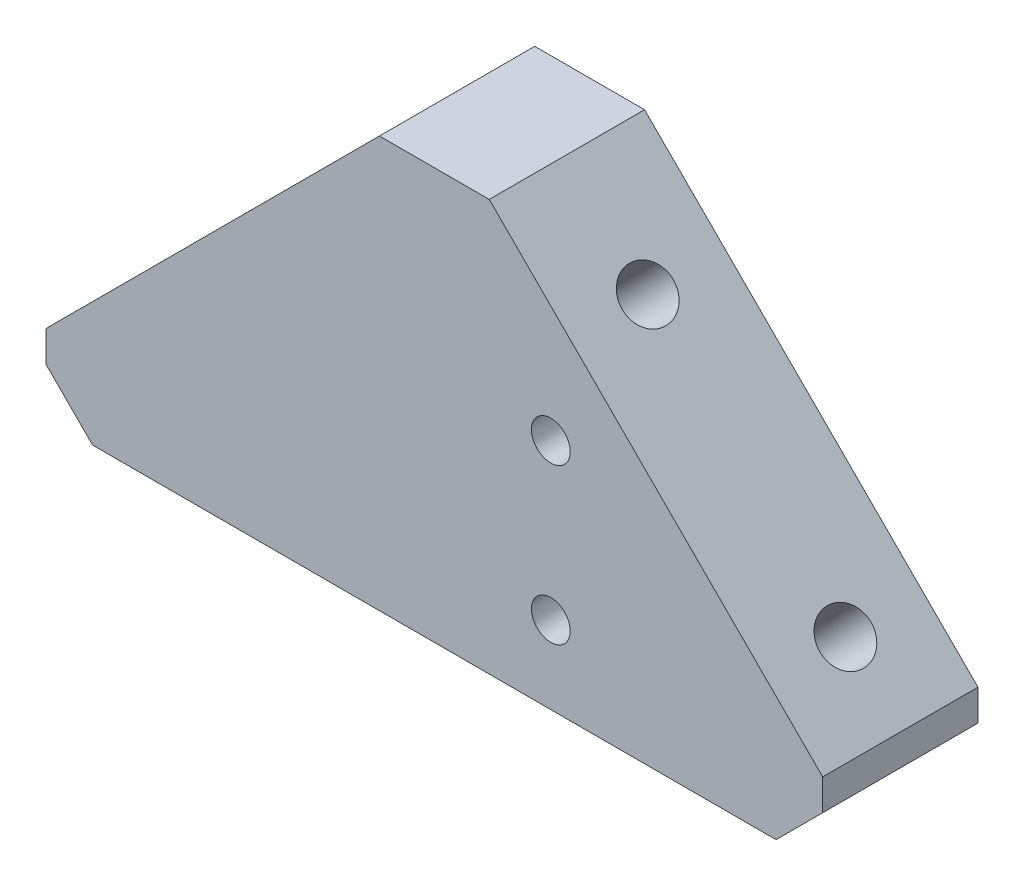
ISO-10303-21;
HEADER;
FILE_DESCRIPTION(('STEP AP214'),'2;1');
FILE_NAME('part.step','',(''),(''),'','','');
FILE_SCHEMA(('AUTOMOTIVE_DESIGN { 1 0 10303 214 1 1 1 1 }'));
ENDSEC;
DATA;
#1=APPLICATION_CONTEXT('core data for automotive mechanical design processes');
#2=APPLICATION_PROTOCOL_DEFINITION('international standard','automotive_design',2000,#1);
#3=PRODUCT_CONTEXT('',#1,'mechanical');
#4=PRODUCT('Part','Part','',(#3));
#5=PRODUCT_RELATED_PRODUCT_CATEGORY('part','',(#4));
#6=PRODUCT_DEFINITION_FORMATION('','',#4);
#7=PRODUCT_DEFINITION_CONTEXT('part definition',#1,'design');
#8=PRODUCT_DEFINITION('design','',#6,#7);
#9=PRODUCT_DEFINITION_SHAPE('','',#8);
#10=(LENGTH_UNIT() NAMED_UNIT(*) SI_UNIT(.MILLI.,.METRE.));
#11=(NAMED_UNIT(*) PLANE_ANGLE_UNIT() SI_UNIT($,.RADIAN.));
#12=(NAMED_UNIT(*) SI_UNIT($,.STERADIAN.) SOLID_ANGLE_UNIT());
#13=UNCERTAINTY_MEASURE_WITH_UNIT(LENGTH_MEASURE(1.E-05),#10,'distance_accuracy_value','');
#14=(GEOMETRIC_REPRESENTATION_CONTEXT(3) GLOBAL_UNCERTAINTY_ASSIGNED_CONTEXT((#13)) GLOBAL_UNIT_ASSIGNED_CONTEXT((#10,
#11,#12)) REPRESENTATION_CONTEXT('',''));
#15=CARTESIAN_POINT('',(0.,0.,0.));
#16=DIRECTION('',(0.,0.,1.));
#17=DIRECTION('',(1.,0.,0.));
#18=AXIS2_PLACEMENT_3D('',#15,#16,#17);
#19=CARTESIAN_POINT('',(15.8076118445749,2.8786796564404,5.));
#20=DIRECTION('',(0.707106781186551,0.707106781186544,0.));
#21=DIRECTION('',(-0.707106781186544,0.707106781186551,0.));
#22=AXIS2_PLACEMENT_3D('',#19,#20,#21);
#23=CYLINDRICAL_SURFACE('',#22,1.65);
#24=CARTESIAN_POINT('',(21.4644660940673,8.53553390593276,5.));
#25=DIRECTION('',(0.707106781186551,0.707106781186544,0.));
#26=DIRECTION('',(-0.707106781186544,0.707106781186551,0.));
#27=AXIS2_PLACEMENT_3D('',#24,#25,#26);
#28=CIRCLE('',#27,1.65);
#29=CARTESIAN_POINT('',(20.2977399051095,9.70226009489057,5.));
#30=VERTEX_POINT('',#29);
#31=EDGE_CURVE('E165',#30,#30,#28,.T.);
#32=ORIENTED_EDGE('',*,*,#31,.T.);
#33=EDGE_LOOP('',(#32));
#34=FACE_BOUND('',#33,.T.);
#35=CARTESIAN_POINT('',(16.,3.07106781186554,5.));
#36=DIRECTION('',(0.382683432365092,0.923879532511286,0.));
#37=DIRECTION('',(0.923879532511286,-0.382683432365092,0.));
#38=AXIS2_PLACEMENT_3D('',#35,#36,#37);
#39=ELLIPSE('',#38,1.78594713048245,1.65);
#40=CARTESIAN_POINT('',(16.,3.07106781186554,3.35));
#41=VERTEX_POINT('',#40);
#42=CARTESIAN_POINT('',(16.,3.07106781186554,6.65));
#43=VERTEX_POINT('',#42);
#44=EDGE_CURVE('E315',#41,#43,#39,.F.);
#45=ORIENTED_EDGE('',*,*,#44,.T.);
#46=CARTESIAN_POINT('',(16.,3.07106781186554,5.));
#47=DIRECTION('',(0.923879532511286,-0.382683432365092,0.));
#48=DIRECTION('',(0.382683432365092,0.923879532511286,0.));
#49=AXIS2_PLACEMENT_3D('',#46,#47,#48);
#50=ELLIPSE('',#49,4.31165778409202,1.65);
#51=EDGE_CURVE('E317',#43,#41,#50,.F.);
#52=ORIENTED_EDGE('',*,*,#51,.T.);
#53=EDGE_LOOP('',(#45,#52));
#54=FACE_BOUND('',#53,.T.);
#55=ADVANCED_FACE('F33',(#34,#54),#23,.F.);
#56=CARTESIAN_POINT('',(-15.1005050633883,3.58578643762695,5.));
#57=DIRECTION('',(-0.707106781186551,0.707106781186544,0.));
#58=DIRECTION('',(-0.707106781186544,-0.707106781186551,0.));
#59=AXIS2_PLACEMENT_3D('',#56,#57,#58);
#60=CYLINDRICAL_SURFACE('',#59,1.65);
#61=CARTESIAN_POINT('',(-20.7573593128807,9.24264068711931,5.));
#62=DIRECTION('',(-0.707106781186551,0.707106781186544,0.));
#63=DIRECTION('',(-0.707106781186544,-0.707106781186551,0.));
#64=AXIS2_PLACEMENT_3D('',#61,#62,#63);
#65=CIRCLE('',#64,1.65);
#66=CARTESIAN_POINT('',(-21.9240855018385,8.0759144981615,5.));
#67=VERTEX_POINT('',#66);
#68=EDGE_CURVE('E152',#67,#67,#65,.T.);
#69=ORIENTED_EDGE('',*,*,#68,.T.);
#70=EDGE_LOOP('',(#69));
#71=FACE_BOUND('',#70,.T.);
#72=CARTESIAN_POINT('',(-16.,4.48528137423862,5.));
#73=DIRECTION('',(-0.382683432365092,0.923879532511286,0.));
#74=DIRECTION('',(-0.923879532511286,-0.382683432365092,0.));
#75=AXIS2_PLACEMENT_3D('',#72,#73,#74);
#76=ELLIPSE('',#75,1.78594713048245,1.65);
#77=CARTESIAN_POINT('',(-16.,4.48528137423862,6.65));
#78=VERTEX_POINT('',#77);
#79=CARTESIAN_POINT('',(-16.,4.48528137423862,3.35));
#80=VERTEX_POINT('',#79);
#81=EDGE_CURVE('E334',#78,#80,#76,.F.);
#82=ORIENTED_EDGE('',*,*,#81,.T.);
#83=CARTESIAN_POINT('',(-16.,4.48528137423862,5.));
#84=DIRECTION('',(-0.923879532511286,-0.382683432365092,0.));
#85=DIRECTION('',(-0.382683432365092,0.923879532511286,0.));
#86=AXIS2_PLACEMENT_3D('',#83,#84,#85);
#87=ELLIPSE('',#86,4.31165778409202,1.65);
#88=EDGE_CURVE('E148',#80,#78,#87,.F.);
#89=ORIENTED_EDGE('',*,*,#88,.T.);
#90=EDGE_LOOP('',(#82,#89));
#91=FACE_BOUND('',#90,.T.);
#92=ADVANCED_FACE('F279',(#71,#91),#60,.F.);
#93=CARTESIAN_POINT('',(25.,0.,10.));
#94=DIRECTION('',(-1.,0.,0.));
#95=DIRECTION('',(0.,0.,1.));
#96=AXIS2_PLACEMENT_3D('',#93,#94,#95);
#97=PLANE('',#96);
#98=DIRECTION('',(0.,1.,0.));
#99=VECTOR('',#98,1.);
#100=CARTESIAN_POINT('',(25.,0.,10.));
#101=LINE('',#100,#99);
#102=CARTESIAN_POINT('',(25.,3.,10.));
#103=VERTEX_POINT('',#102);
#104=CARTESIAN_POINT('',(25.,5.,10.));
#105=VERTEX_POINT('',#104);
#106=EDGE_CURVE('E180',#103,#105,#101,.T.);
#107=ORIENTED_EDGE('',*,*,#106,.F.);
#108=DIRECTION('',(0.,0.,-1.));
#109=VECTOR('',#108,1.);
#110=CARTESIAN_POINT('',(25.,3.,10.));
#111=LINE('',#110,#109);
#112=CARTESIAN_POINT('',(25.,3.,0.));
#113=VERTEX_POINT('',#112);
#114=EDGE_CURVE('E217',#103,#113,#111,.T.);
#115=ORIENTED_EDGE('',*,*,#114,.T.);
#116=DIRECTION('',(0.,1.,0.));
#117=VECTOR('',#116,1.);
#118=CARTESIAN_POINT('',(25.,0.,0.));
#119=LINE('',#118,#117);
#120=CARTESIAN_POINT('',(25.,5.,0.));
#121=VERTEX_POINT('',#120);
#122=EDGE_CURVE('E177',#113,#121,#119,.T.);
#123=ORIENTED_EDGE('',*,*,#122,.T.);
#124=DIRECTION('',(0.,0.,-1.));
#125=VECTOR('',#124,1.);
#126=CARTESIAN_POINT('',(25.,5.,10.));
#127=LINE('',#126,#125);
#128=EDGE_CURVE('E204',#105,#121,#127,.T.);
#129=ORIENTED_EDGE('',*,*,#128,.F.);
#130=EDGE_LOOP('',(#107,#115,#123,#129));
#131=FACE_BOUND('',#130,.T.);
#132=ADVANCED_FACE('F238',(#131),#97,.F.);
#133=CARTESIAN_POINT('',(25.,5.,10.));
#134=DIRECTION('',(-0.707106781186551,-0.707106781186544,0.));
#135=DIRECTION('',(0.707106781186544,-0.707106781186551,0.));
#136=AXIS2_PLACEMENT_3D('',#133,#134,#135);
#137=PLANE('',#136);
#138=ORIENTED_EDGE('',*,*,#31,.F.);
#139=EDGE_LOOP('',(#138));
#140=FACE_BOUND('',#139,.T.);
#141=CARTESIAN_POINT('',(8.73654403270949,21.2634559672907,5.));
#142=DIRECTION('',(0.707106781186551,0.707106781186544,0.));
#143=DIRECTION('',(-0.707106781186544,0.707106781186551,0.));
#144=AXIS2_PLACEMENT_3D('',#141,#142,#143);
#145=CIRCLE('',#144,1.65);
#146=CARTESIAN_POINT('',(7.56981784375169,22.4301821562485,5.));
#147=VERTEX_POINT('',#146);
#148=EDGE_CURVE('E170',#147,#147,#145,.T.);
#149=ORIENTED_EDGE('',*,*,#148,.F.);
#150=EDGE_LOOP('',(#149));
#151=FACE_BOUND('',#150,.T.);
#152=DIRECTION('',(-0.707106781186544,0.707106781186551,0.));
#153=VECTOR('',#152,1.);
#154=CARTESIAN_POINT('',(25.,5.,0.));
#155=LINE('',#154,#153);
#156=CARTESIAN_POINT('',(3.53553390593275,26.4644660940675,0.));
#157=VERTEX_POINT('',#156);
#158=EDGE_CURVE('E194',#121,#157,#155,.T.);
#159=ORIENTED_EDGE('',*,*,#158,.T.);
#160=DIRECTION('',(0.,0.,1.));
#161=VECTOR('',#160,1.);
#162=CARTESIAN_POINT('',(3.53553390593275,26.4644660940675,10.));
#163=LINE('',#162,#161);
#164=CARTESIAN_POINT('',(3.53553390593275,26.4644660940675,10.));
#165=VERTEX_POINT('',#164);
#166=EDGE_CURVE('E212',#157,#165,#163,.T.);
#167=ORIENTED_EDGE('',*,*,#166,.T.);
#168=DIRECTION('',(-0.707106781186544,0.707106781186551,0.));
#169=VECTOR('',#168,1.);
#170=CARTESIAN_POINT('',(25.,5.,10.));
#171=LINE('',#170,#169);
#172=EDGE_CURVE('E182',#105,#165,#171,.T.);
#173=ORIENTED_EDGE('',*,*,#172,.F.);
#174=ORIENTED_EDGE('',*,*,#128,.T.);
#175=EDGE_LOOP('',(#159,#167,#173,#174));
#176=FACE_BOUND('',#175,.T.);
#177=ADVANCED_FACE('F260',(#140,#151,#176),#137,.F.);
#178=CARTESIAN_POINT('',(-25.,5.,10.));
#179=DIRECTION('',(0.707106781186551,-0.707106781186544,0.));
#180=DIRECTION('',(0.707106781186544,0.707106781186551,0.));
#181=AXIS2_PLACEMENT_3D('',#178,#179,#180);
#182=PLANE('',#181);
#183=ORIENTED_EDGE('',*,*,#68,.F.);
#184=EDGE_LOOP('',(#183));
#185=FACE_BOUND('',#184,.T.);
#186=CARTESIAN_POINT('',(-8.02943725152294,21.9705627484772,5.));
#187=DIRECTION('',(-0.707106781186551,0.707106781186544,0.));
#188=DIRECTION('',(-0.707106781186544,-0.707106781186551,0.));
#189=AXIS2_PLACEMENT_3D('',#186,#187,#188);
#190=CIRCLE('',#189,1.65);
#191=CARTESIAN_POINT('',(-9.19616344048074,20.8038365595194,5.));
#192=VERTEX_POINT('',#191);
#193=EDGE_CURVE('E151',#192,#192,#190,.T.);
#194=ORIENTED_EDGE('',*,*,#193,.F.);
#195=EDGE_LOOP('',(#194));
#196=FACE_BOUND('',#195,.T.);
#197=DIRECTION('',(-0.707106781186544,-0.707106781186551,0.));
#198=VECTOR('',#197,1.);
#199=CARTESIAN_POINT('',(-25.,5.,10.));
#200=LINE('',#199,#198);
#201=CARTESIAN_POINT('',(-3.53553390593269,26.4644660940675,10.));
#202=VERTEX_POINT('',#201);
#203=CARTESIAN_POINT('',(-25.,5.,10.));
#204=VERTEX_POINT('',#203);
#205=EDGE_CURVE('E186',#202,#204,#200,.T.);
#206=ORIENTED_EDGE('',*,*,#205,.F.);
#207=DIRECTION('',(0.,0.,-1.));
#208=VECTOR('',#207,1.);
#209=CARTESIAN_POINT('',(-3.53553390593269,26.4644660940675,10.));
#210=LINE('',#209,#208);
#211=CARTESIAN_POINT('',(-3.53553390593269,26.4644660940675,0.));
#212=VERTEX_POINT('',#211);
#213=EDGE_CURVE('E207',#202,#212,#210,.T.);
#214=ORIENTED_EDGE('',*,*,#213,.T.);
#215=DIRECTION('',(-0.707106781186544,-0.707106781186551,0.));
#216=VECTOR('',#215,1.);
#217=CARTESIAN_POINT('',(-25.,5.,0.));
#218=LINE('',#217,#216);
#219=CARTESIAN_POINT('',(-25.,5.,0.));
#220=VERTEX_POINT('',#219);
#221=EDGE_CURVE('E197',#212,#220,#218,.T.);
#222=ORIENTED_EDGE('',*,*,#221,.T.);
#223=DIRECTION('',(0.,0.,-1.));
#224=VECTOR('',#223,1.);
#225=CARTESIAN_POINT('',(-25.,5.,10.));
#226=LINE('',#225,#224);
#227=EDGE_CURVE('E192',#204,#220,#226,.T.);
#228=ORIENTED_EDGE('',*,*,#227,.F.);
#229=EDGE_LOOP('',(#206,#214,#222,#228));
#230=FACE_BOUND('',#229,.T.);
#231=ADVANCED_FACE('F255',(#185,#196,#230),#182,.F.);
#232=CARTESIAN_POINT('',(-25.,0.,10.));
#233=DIRECTION('',(1.,0.,0.));
#234=DIRECTION('',(0.,0.,-1.));
#235=AXIS2_PLACEMENT_3D('',#232,#233,#234);
#236=PLANE('',#235);
#237=DIRECTION('',(0.,-1.,0.));
#238=VECTOR('',#237,1.);
#239=CARTESIAN_POINT('',(-25.,0.,0.));
#240=LINE('',#239,#238);
#241=CARTESIAN_POINT('',(-25.,3.00000000000002,0.));
#242=VERTEX_POINT('',#241);
#243=EDGE_CURVE('E199',#220,#242,#240,.T.);
#244=ORIENTED_EDGE('',*,*,#243,.T.);
#245=DIRECTION('',(0.,0.,1.));
#246=VECTOR('',#245,1.);
#247=CARTESIAN_POINT('',(-25.,3.00000000000002,10.));
#248=LINE('',#247,#246);
#249=CARTESIAN_POINT('',(-25.,3.00000000000002,10.));
#250=VERTEX_POINT('',#249);
#251=EDGE_CURVE('E11',#242,#250,#248,.T.);
#252=ORIENTED_EDGE('',*,*,#251,.T.);
#253=DIRECTION('',(0.,-1.,0.));
#254=VECTOR('',#253,1.);
#255=CARTESIAN_POINT('',(-25.,0.,10.));
#256=LINE('',#255,#254);
#257=EDGE_CURVE('E188',#204,#250,#256,.T.);
#258=ORIENTED_EDGE('',*,*,#257,.F.);
#259=ORIENTED_EDGE('',*,*,#227,.T.);
#260=EDGE_LOOP('',(#244,#252,#258,#259));
#261=FACE_BOUND('',#260,.T.);
#262=ADVANCED_FACE('F251',(#261),#236,.F.);
#263=CARTESIAN_POINT('',(-25.,0.,10.));
#264=DIRECTION('',(0.,1.,0.));
#265=DIRECTION('',(0.,0.,1.));
#266=AXIS2_PLACEMENT_3D('',#263,#264,#265);
#267=PLANE('',#266);
#268=CARTESIAN_POINT('',(-16.,0.,5.));
#269=DIRECTION('',(0.,-1.,0.));
#270=DIRECTION('',(0.,0.,-1.));
#271=AXIS2_PLACEMENT_3D('',#268,#269,#270);
#272=CIRCLE('',#271,1.65);
#273=CARTESIAN_POINT('',(-16.,0.,3.35));
#274=VERTEX_POINT('',#273);
#275=EDGE_CURVE('E347',#274,#274,#272,.T.);
#276=ORIENTED_EDGE('',*,*,#275,.F.);
#277=EDGE_LOOP('',(#276));
#278=FACE_BOUND('',#277,.T.);
#279=CARTESIAN_POINT('',(16.,0.,5.));
#280=DIRECTION('',(0.,-1.,0.));
#281=DIRECTION('',(0.,0.,1.));
#282=AXIS2_PLACEMENT_3D('',#279,#280,#281);
#283=CIRCLE('',#282,1.65);
#284=CARTESIAN_POINT('',(16.,0.,6.65));
#285=VERTEX_POINT('',#284);
#286=EDGE_CURVE('E340',#285,#285,#283,.T.);
#287=ORIENTED_EDGE('',*,*,#286,.F.);
#288=EDGE_LOOP('',(#287));
#289=FACE_BOUND('',#288,.T.);
#290=CARTESIAN_POINT('',(0.,0.,5.));
#291=DIRECTION('',(0.,-1.,0.));
#292=DIRECTION('',(0.,0.,-1.));
#293=AXIS2_PLACEMENT_3D('',#290,#291,#292);
#294=CIRCLE('',#293,1.65);
#295=CARTESIAN_POINT('',(0.,0.,3.35));
#296=VERTEX_POINT('',#295);
#297=EDGE_CURVE('E161',#296,#296,#294,.T.);
#298=ORIENTED_EDGE('',*,*,#297,.F.);
#299=EDGE_LOOP('',(#298));
#300=FACE_BOUND('',#299,.T.);
#301=DIRECTION('',(1.,0.,0.));
#302=VECTOR('',#301,1.);
#303=CARTESIAN_POINT('',(-25.,0.,0.));
#304=LINE('',#303,#302);
#305=CARTESIAN_POINT('',(-22.,0.,0.));
#306=VERTEX_POINT('',#305);
#307=CARTESIAN_POINT('',(22.,0.,0.));
#308=VERTEX_POINT('',#307);
#309=EDGE_CURVE('E183',#306,#308,#304,.T.);
#310=ORIENTED_EDGE('',*,*,#309,.T.);
#311=DIRECTION('',(0.,0.,1.));
#312=VECTOR('',#311,1.);
#313=CARTESIAN_POINT('',(22.,0.,10.));
#314=LINE('',#313,#312);
#315=CARTESIAN_POINT('',(22.,0.,10.));
#316=VERTEX_POINT('',#315);
#317=EDGE_CURVE('E54',#308,#316,#314,.T.);
#318=ORIENTED_EDGE('',*,*,#317,.T.);
#319=DIRECTION('',(1.,0.,0.));
#320=VECTOR('',#319,1.);
#321=CARTESIAN_POINT('',(-25.,0.,10.));
#322=LINE('',#321,#320);
#323=CARTESIAN_POINT('',(-22.,0.,10.));
#324=VERTEX_POINT('',#323);
#325=EDGE_CURVE('E190',#324,#316,#322,.T.);
#326=ORIENTED_EDGE('',*,*,#325,.F.);
#327=DIRECTION('',(0.,0.,-1.));
#328=VECTOR('',#327,1.);
#329=CARTESIAN_POINT('',(-22.,0.,10.));
#330=LINE('',#329,#328);
#331=EDGE_CURVE('E224',#324,#306,#330,.T.);
#332=ORIENTED_EDGE('',*,*,#331,.T.);
#333=EDGE_LOOP('',(#310,#318,#326,#332));
#334=FACE_BOUND('',#333,.T.);
#335=ADVANCED_FACE('F245',(#278,#289,#300,#334),#267,.F.);
#336=CARTESIAN_POINT('',(0.,0.,10.));
#337=DIRECTION('',(0.,0.,-1.));
#338=DIRECTION('',(-1.,0.,0.));
#339=AXIS2_PLACEMENT_3D('',#336,#337,#338);
#340=PLANE('',#339);
#341=CARTESIAN_POINT('',(7.5,5.,10.));
#342=DIRECTION('',(0.,0.,1.));
#343=DIRECTION('',(1.,0.,0.));
#344=AXIS2_PLACEMENT_3D('',#341,#342,#343);
#345=CIRCLE('',#344,1.25);
#346=CARTESIAN_POINT('',(8.75,5.,10.));
#347=VERTEX_POINT('',#346);
#348=EDGE_CURVE('E358',#347,#347,#345,.T.);
#349=ORIENTED_EDGE('',*,*,#348,.F.);
#350=EDGE_LOOP('',(#349));
#351=FACE_BOUND('',#350,.T.);
#352=CARTESIAN_POINT('',(7.5,15.,10.));
#353=DIRECTION('',(0.,0.,1.));
#354=DIRECTION('',(1.,0.,0.));
#355=AXIS2_PLACEMENT_3D('',#352,#353,#354);
#356=CIRCLE('',#355,1.25);
#357=CARTESIAN_POINT('',(8.75,15.,10.));
#358=VERTEX_POINT('',#357);
#359=EDGE_CURVE('E352',#358,#358,#356,.T.);
#360=ORIENTED_EDGE('',*,*,#359,.F.);
#361=EDGE_LOOP('',(#360));
#362=FACE_BOUND('',#361,.T.);
#363=ORIENTED_EDGE('',*,*,#325,.T.);
#364=DIRECTION('',(-0.707106781186549,-0.707106781186546,0.));
#365=VECTOR('',#364,1.);
#366=CARTESIAN_POINT('',(25.,3.,10.));
#367=LINE('',#366,#365);
#368=EDGE_CURVE('E41',#316,#103,#367,.F.);
#369=ORIENTED_EDGE('',*,*,#368,.T.);
#370=ORIENTED_EDGE('',*,*,#106,.T.);
#371=ORIENTED_EDGE('',*,*,#172,.T.);
#372=DIRECTION('',(1.,0.,0.));
#373=VECTOR('',#372,1.);
#374=CARTESIAN_POINT('',(-3.53553390593269,26.4644660940675,10.));
#375=LINE('',#374,#373);
#376=EDGE_CURVE('E141',#165,#202,#375,.F.);
#377=ORIENTED_EDGE('',*,*,#376,.T.);
#378=ORIENTED_EDGE('',*,*,#205,.T.);
#379=ORIENTED_EDGE('',*,*,#257,.T.);
#380=DIRECTION('',(-0.707106781186546,0.707106781186549,0.));
#381=VECTOR('',#380,1.);
#382=CARTESIAN_POINT('',(-22.,0.,10.));
#383=LINE('',#382,#381);
#384=EDGE_CURVE('E228',#250,#324,#383,.F.);
#385=ORIENTED_EDGE('',*,*,#384,.T.);
#386=EDGE_LOOP('',(#363,#369,#370,#371,#377,#378,#379,#385));
#387=FACE_BOUND('',#386,.T.);
#388=ADVANCED_FACE('F232',(#351,#362,#387),#340,.F.);
#389=CARTESIAN_POINT('',(0.,0.,0.));
#390=DIRECTION('',(0.,0.,-1.));
#391=DIRECTION('',(-1.,0.,0.));
#392=AXIS2_PLACEMENT_3D('',#389,#390,#391);
#393=PLANE('',#392);
#394=CARTESIAN_POINT('',(7.5,5.,0.));
#395=DIRECTION('',(0.,0.,1.));
#396=DIRECTION('',(1.,0.,0.));
#397=AXIS2_PLACEMENT_3D('',#394,#395,#396);
#398=CIRCLE('',#397,1.25);
#399=CARTESIAN_POINT('',(8.75,5.,0.));
#400=VERTEX_POINT('',#399);
#401=EDGE_CURVE('E355',#400,#400,#398,.T.);
#402=ORIENTED_EDGE('',*,*,#401,.T.);
#403=EDGE_LOOP('',(#402));
#404=FACE_BOUND('',#403,.T.);
#405=CARTESIAN_POINT('',(7.5,15.,0.));
#406=DIRECTION('',(0.,0.,1.));
#407=DIRECTION('',(1.,0.,0.));
#408=AXIS2_PLACEMENT_3D('',#405,#406,#407);
#409=CIRCLE('',#408,1.25);
#410=CARTESIAN_POINT('',(8.75,15.,0.));
#411=VERTEX_POINT('',#410);
#412=EDGE_CURVE('E344',#411,#411,#409,.T.);
#413=ORIENTED_EDGE('',*,*,#412,.T.);
#414=EDGE_LOOP('',(#413));
#415=FACE_BOUND('',#414,.T.);
#416=ORIENTED_EDGE('',*,*,#122,.F.);
#417=DIRECTION('',(0.707106781186549,0.707106781186546,0.));
#418=VECTOR('',#417,1.);
#419=CARTESIAN_POINT('',(10.9999999999999,-11.,0.));
#420=LINE('',#419,#418);
#421=EDGE_CURVE('E222',#113,#308,#420,.F.);
#422=ORIENTED_EDGE('',*,*,#421,.T.);
#423=ORIENTED_EDGE('',*,*,#309,.F.);
#424=DIRECTION('',(0.707106781186546,-0.707106781186549,0.));
#425=VECTOR('',#424,1.);
#426=CARTESIAN_POINT('',(-11.,-11.,0.));
#427=LINE('',#426,#425);
#428=EDGE_CURVE('E220',#306,#242,#427,.F.);
#429=ORIENTED_EDGE('',*,*,#428,.T.);
#430=ORIENTED_EDGE('',*,*,#243,.F.);
#431=ORIENTED_EDGE('',*,*,#221,.F.);
#432=DIRECTION('',(-1.,0.,0.));
#433=VECTOR('',#432,1.);
#434=CARTESIAN_POINT('',(1.81788506538573E-13,26.4644660940675,0.));
#435=LINE('',#434,#433);
#436=EDGE_CURVE('E210',#212,#157,#435,.F.);
#437=ORIENTED_EDGE('',*,*,#436,.T.);
#438=ORIENTED_EDGE('',*,*,#158,.F.);
#439=EDGE_LOOP('',(#416,#422,#423,#429,#430,#431,#437,#438));
#440=FACE_BOUND('',#439,.T.);
#441=ADVANCED_FACE('F243',(#404,#415,#440),#393,.T.);
#442=CARTESIAN_POINT('',(3.07968978321708,15.6066017177983,5.));
#443=DIRECTION('',(0.707106781186551,0.707106781186544,0.));
#444=DIRECTION('',(-0.707106781186544,0.707106781186551,0.));
#445=AXIS2_PLACEMENT_3D('',#442,#443,#444);
#446=CYLINDRICAL_SURFACE('',#445,1.65);
#447=CARTESIAN_POINT('',(3.07968978321708,15.6066017177983,5.));
#448=DIRECTION('',(0.707106781186551,0.707106781186544,0.));
#449=DIRECTION('',(-0.707106781186544,0.707106781186551,0.));
#450=AXIS2_PLACEMENT_3D('',#447,#448,#449);
#451=CIRCLE('',#450,1.65);
#452=CARTESIAN_POINT('',(1.91296359425928,16.7733279067561,5.));
#453=VERTEX_POINT('',#452);
#454=EDGE_CURVE('E174',#453,#453,#451,.T.);
#455=ORIENTED_EDGE('',*,*,#454,.F.);
#456=EDGE_LOOP('',(#455));
#457=FACE_BOUND('',#456,.T.);
#458=ORIENTED_EDGE('',*,*,#148,.T.);
#459=EDGE_LOOP('',(#458));
#460=FACE_BOUND('',#459,.T.);
#461=ADVANCED_FACE('F412',(#457,#460),#446,.F.);
#462=CARTESIAN_POINT('',(3.07968978321708,15.6066017177983,5.));
#463=DIRECTION('',(0.707106781186551,0.707106781186544,0.));
#464=DIRECTION('',(-0.707106781186544,0.707106781186551,0.));
#465=AXIS2_PLACEMENT_3D('',#462,#463,#464);
#466=PLANE('',#465);
#467=ORIENTED_EDGE('',*,*,#454,.T.);
#468=EDGE_LOOP('',(#467));
#469=FACE_BOUND('',#468,.T.);
#470=ADVANCED_FACE('F407',(#469),#466,.T.);
#471=CARTESIAN_POINT('',(-2.37258300203054,16.3137084989849,5.));
#472=DIRECTION('',(-0.707106781186551,0.707106781186544,0.));
#473=DIRECTION('',(-0.707106781186544,-0.707106781186551,0.));
#474=AXIS2_PLACEMENT_3D('',#471,#472,#473);
#475=CYLINDRICAL_SURFACE('',#474,1.65);
#476=CARTESIAN_POINT('',(-2.37258300203054,16.3137084989849,5.));
#477=DIRECTION('',(-0.707106781186551,0.707106781186544,0.));
#478=DIRECTION('',(-0.707106781186544,-0.707106781186551,0.));
#479=AXIS2_PLACEMENT_3D('',#476,#477,#478);
#480=CIRCLE('',#479,1.65);
#481=CARTESIAN_POINT('',(-3.53930919098833,15.1469823100271,5.));
#482=VERTEX_POINT('',#481);
#483=EDGE_CURVE('E155',#482,#482,#480,.T.);
#484=ORIENTED_EDGE('',*,*,#483,.F.);
#485=EDGE_LOOP('',(#484));
#486=FACE_BOUND('',#485,.T.);
#487=ORIENTED_EDGE('',*,*,#193,.T.);
#488=EDGE_LOOP('',(#487));
#489=FACE_BOUND('',#488,.T.);
#490=ADVANCED_FACE('F274',(#486,#489),#475,.F.);
#491=CARTESIAN_POINT('',(-2.37258300203054,16.3137084989849,5.));
#492=DIRECTION('',(-0.707106781186551,0.707106781186544,0.));
#493=DIRECTION('',(-0.707106781186544,-0.707106781186551,0.));
#494=AXIS2_PLACEMENT_3D('',#491,#492,#493);
#495=PLANE('',#494);
#496=ORIENTED_EDGE('',*,*,#483,.T.);
#497=EDGE_LOOP('',(#496));
#498=FACE_BOUND('',#497,.T.);
#499=ADVANCED_FACE('F265',(#498),#495,.T.);
#500=CARTESIAN_POINT('',(-3.53553390593269,26.4644660940675,10.));
#501=DIRECTION('',(0.,-1.,0.));
#502=DIRECTION('',(0.,0.,-1.));
#503=AXIS2_PLACEMENT_3D('',#500,#501,#502);
#504=PLANE('',#503);
#505=ORIENTED_EDGE('',*,*,#376,.F.);
#506=ORIENTED_EDGE('',*,*,#166,.F.);
#507=ORIENTED_EDGE('',*,*,#436,.F.);
#508=ORIENTED_EDGE('',*,*,#213,.F.);
#509=EDGE_LOOP('',(#505,#506,#507,#508));
#510=FACE_BOUND('',#509,.T.);
#511=ADVANCED_FACE('F262',(#510),#504,.F.);
#512=CARTESIAN_POINT('',(0.,10.,5.));
#513=DIRECTION('',(0.,-1.,0.));
#514=DIRECTION('',(0.,0.,-1.));
#515=AXIS2_PLACEMENT_3D('',#512,#513,#514);
#516=CYLINDRICAL_SURFACE('',#515,1.65);
#517=CARTESIAN_POINT('',(0.,10.,5.));
#518=DIRECTION('',(0.,-1.,0.));
#519=DIRECTION('',(0.,0.,-1.));
#520=AXIS2_PLACEMENT_3D('',#517,#518,#519);
#521=CIRCLE('',#520,1.65);
#522=CARTESIAN_POINT('',(0.,10.,3.35));
#523=VERTEX_POINT('',#522);
#524=EDGE_CURVE('E158',#523,#523,#521,.T.);
#525=ORIENTED_EDGE('',*,*,#524,.F.);
#526=EDGE_LOOP('',(#525));
#527=FACE_BOUND('',#526,.T.);
#528=ORIENTED_EDGE('',*,*,#297,.T.);
#529=EDGE_LOOP('',(#528));
#530=FACE_BOUND('',#529,.T.);
#531=ADVANCED_FACE('F264',(#527,#530),#516,.F.);
#532=CARTESIAN_POINT('',(0.,10.,5.));
#533=DIRECTION('',(0.,-1.,0.));
#534=DIRECTION('',(0.,0.,-1.));
#535=AXIS2_PLACEMENT_3D('',#532,#533,#534);
#536=PLANE('',#535);
#537=ORIENTED_EDGE('',*,*,#524,.T.);
#538=EDGE_LOOP('',(#537));
#539=FACE_BOUND('',#538,.T.);
#540=ADVANCED_FACE('F271',(#539),#536,.T.);
#541=CARTESIAN_POINT('',(-16.,10.,5.));
#542=DIRECTION('',(0.,-1.,0.));
#543=DIRECTION('',(0.,0.,-1.));
#544=AXIS2_PLACEMENT_3D('',#541,#542,#543);
#545=CYLINDRICAL_SURFACE('',#544,1.65);
#546=ORIENTED_EDGE('',*,*,#275,.T.);
#547=EDGE_LOOP('',(#546));
#548=FACE_BOUND('',#547,.T.);
#549=CARTESIAN_POINT('',(-16.,4.48528137423862,5.));
#550=DIRECTION('',(-0.923879532511286,-0.382683432365092,0.));
#551=DIRECTION('',(-0.382683432365092,0.923879532511286,0.));
#552=AXIS2_PLACEMENT_3D('',#549,#550,#551);
#553=ELLIPSE('',#552,4.31165778409202,1.65);
#554=CARTESIAN_POINT('',(-15.4730880654188,3.21320343559647,6.56360602876681));
#555=VERTEX_POINT('',#554);
#556=EDGE_CURVE('E136',#555,#78,#553,.T.);
#557=ORIENTED_EDGE('',*,*,#556,.F.);
#558=CARTESIAN_POINT('',(-16.,2.68629150101527,5.));
#559=DIRECTION('',(-0.707106781186551,0.707106781186544,0.));
#560=DIRECTION('',(-0.707106781186544,-0.707106781186551,0.));
#561=AXIS2_PLACEMENT_3D('',#558,#559,#560);
#562=ELLIPSE('',#561,2.33345237791562,1.65);
#563=CARTESIAN_POINT('',(-15.4730880654188,3.21320343559647,3.43639397123319));
#564=VERTEX_POINT('',#563);
#565=EDGE_CURVE('E130',#555,#564,#562,.T.);
#566=ORIENTED_EDGE('',*,*,#565,.T.);
#567=EDGE_CURVE('E133',#80,#564,#553,.T.);
#568=ORIENTED_EDGE('',*,*,#567,.F.);
#569=ORIENTED_EDGE('',*,*,#81,.F.);
#570=EDGE_LOOP('',(#557,#566,#568,#569));
#571=FACE_BOUND('',#570,.T.);
#572=ADVANCED_FACE('F132',(#548,#571),#545,.F.);
#573=CARTESIAN_POINT('',(-16.,10.,5.));
#574=DIRECTION('',(0.,-1.,0.));
#575=DIRECTION('',(0.,0.,-1.));
#576=AXIS2_PLACEMENT_3D('',#573,#574,#575);
#577=CIRCLE('',#576,1.65);
#578=CARTESIAN_POINT('',(-16.,10.,3.35));
#579=VERTEX_POINT('',#578);
#580=EDGE_CURVE('E339',#579,#579,#577,.T.);
#581=ORIENTED_EDGE('',*,*,#580,.F.);
#582=EDGE_LOOP('',(#581));
#583=FACE_BOUND('',#582,.T.);
#584=ORIENTED_EDGE('',*,*,#88,.F.);
#585=CARTESIAN_POINT('',(-16.,4.48528137423862,5.));
#586=DIRECTION('',(-0.382683432365092,0.923879532511286,0.));
#587=DIRECTION('',(-0.923879532511286,-0.382683432365092,0.));
#588=AXIS2_PLACEMENT_3D('',#585,#586,#587);
#589=ELLIPSE('',#588,1.78594713048245,1.65);
#590=EDGE_CURVE('E147',#78,#80,#589,.T.);
#591=ORIENTED_EDGE('',*,*,#590,.F.);
#592=EDGE_LOOP('',(#584,#591));
#593=FACE_BOUND('',#592,.T.);
#594=ADVANCED_FACE('F389',(#583,#593),#545,.F.);
#595=CARTESIAN_POINT('',(-16.,10.,5.));
#596=DIRECTION('',(0.,-1.,0.));
#597=DIRECTION('',(0.,0.,-1.));
#598=AXIS2_PLACEMENT_3D('',#595,#596,#597);
#599=PLANE('',#598);
#600=ORIENTED_EDGE('',*,*,#580,.T.);
#601=EDGE_LOOP('',(#600));
#602=FACE_BOUND('',#601,.T.);
#603=ADVANCED_FACE('F386',(#602),#599,.T.);
#604=CARTESIAN_POINT('',(16.,10.,5.));
#605=DIRECTION('',(0.,-1.,0.));
#606=DIRECTION('',(0.,0.,-1.));
#607=AXIS2_PLACEMENT_3D('',#604,#605,#606);
#608=CYLINDRICAL_SURFACE('',#607,1.65);
#609=CARTESIAN_POINT('',(16.,10.,5.));
#610=DIRECTION('',(0.,-1.,0.));
#611=DIRECTION('',(0.,0.,1.));
#612=AXIS2_PLACEMENT_3D('',#609,#610,#611);
#613=CIRCLE('',#612,1.65);
#614=CARTESIAN_POINT('',(16.,10.,6.65));
#615=VERTEX_POINT('',#614);
#616=EDGE_CURVE('E343',#615,#615,#613,.T.);
#617=ORIENTED_EDGE('',*,*,#616,.F.);
#618=EDGE_LOOP('',(#617));
#619=FACE_BOUND('',#618,.T.);
#620=ORIENTED_EDGE('',*,*,#286,.T.);
#621=EDGE_LOOP('',(#620));
#622=FACE_BOUND('',#621,.T.);
#623=CARTESIAN_POINT('',(16.,2.68629150101527,5.));
#624=DIRECTION('',(0.707106781186551,0.707106781186544,0.));
#625=DIRECTION('',(0.707106781186544,-0.707106781186551,0.));
#626=AXIS2_PLACEMENT_3D('',#623,#624,#625);
#627=ELLIPSE('',#626,2.33345237791562,1.65);
#628=CARTESIAN_POINT('',(15.8873016277919,2.79898987322337,3.35385326386083));
#629=VERTEX_POINT('',#628);
#630=CARTESIAN_POINT('',(15.3431457505076,3.34314575050769,3.48638099413236));
#631=VERTEX_POINT('',#630);
#632=EDGE_CURVE('E216',#629,#631,#627,.T.);
#633=ORIENTED_EDGE('',*,*,#632,.T.);
#634=CARTESIAN_POINT('',(16.,3.07106781186554,5.));
#635=DIRECTION('',(0.382683432365092,0.923879532511286,0.));
#636=DIRECTION('',(0.923879532511286,-0.382683432365092,0.));
#637=AXIS2_PLACEMENT_3D('',#634,#635,#636);
#638=ELLIPSE('',#637,1.78594713048245,1.65);
#639=EDGE_CURVE('E312',#41,#631,#638,.T.);
#640=ORIENTED_EDGE('',*,*,#639,.F.);
#641=ORIENTED_EDGE('',*,*,#51,.F.);
#642=CARTESIAN_POINT('',(15.3431457505076,3.3431457505077,6.51361900586764));
#643=VERTEX_POINT('',#642);
#644=EDGE_CURVE('E305',#643,#43,#638,.T.);
#645=ORIENTED_EDGE('',*,*,#644,.F.);
#646=CARTESIAN_POINT('',(15.8873016277919,2.79898987322336,6.64614673613917));
#647=VERTEX_POINT('',#646);
#648=EDGE_CURVE('E140',#643,#647,#627,.T.);
#649=ORIENTED_EDGE('',*,*,#648,.T.);
#650=CARTESIAN_POINT('',(16.,3.07106781186554,5.));
#651=DIRECTION('',(0.923879532511286,-0.382683432365092,0.));
#652=DIRECTION('',(0.382683432365092,0.923879532511286,0.));
#653=AXIS2_PLACEMENT_3D('',#650,#651,#652);
#654=ELLIPSE('',#653,4.31165778409202,1.65);
#655=EDGE_CURVE('E307',#43,#647,#654,.T.);
#656=ORIENTED_EDGE('',*,*,#655,.F.);
#657=ORIENTED_EDGE('',*,*,#44,.F.);
#658=EDGE_CURVE('E319',#629,#41,#654,.T.);
#659=ORIENTED_EDGE('',*,*,#658,.F.);
#660=EDGE_LOOP('',(#633,#640,#641,#645,#649,#656,#657,#659));
#661=FACE_BOUND('',#660,.T.);
#662=ADVANCED_FACE('F313',(#619,#622,#661),#608,.F.);
#663=CARTESIAN_POINT('',(16.,10.,5.));
#664=DIRECTION('',(0.,1.,0.));
#665=DIRECTION('',(0.,0.,1.));
#666=AXIS2_PLACEMENT_3D('',#663,#664,#665);
#667=PLANE('',#666);
#668=ORIENTED_EDGE('',*,*,#616,.T.);
#669=EDGE_LOOP('',(#668));
#670=FACE_BOUND('',#669,.T.);
#671=ADVANCED_FACE('F394',(#670),#667,.F.);
#672=CARTESIAN_POINT('',(15.8076118445749,2.8786796564404,5.));
#673=DIRECTION('',(0.707106781186551,0.707106781186544,0.));
#674=DIRECTION('',(-0.707106781186544,0.707106781186551,0.));
#675=AXIS2_PLACEMENT_3D('',#672,#673,#674);
#676=PLANE('',#675);
#677=ORIENTED_EDGE('',*,*,#632,.F.);
#678=CARTESIAN_POINT('',(15.8076118445749,2.8786796564404,5.));
#679=DIRECTION('',(0.707106781186551,0.707106781186544,0.));
#680=DIRECTION('',(-0.707106781186544,0.707106781186551,0.));
#681=AXIS2_PLACEMENT_3D('',#678,#679,#680);
#682=CIRCLE('',#681,1.65);
#683=EDGE_CURVE('E171',#629,#631,#682,.T.);
#684=ORIENTED_EDGE('',*,*,#683,.T.);
#685=EDGE_LOOP('',(#677,#684));
#686=FACE_BOUND('',#685,.T.);
#687=ADVANCED_FACE('F293',(#686),#676,.T.);
#688=ORIENTED_EDGE('',*,*,#683,.F.);
#689=ORIENTED_EDGE('',*,*,#658,.T.);
#690=ORIENTED_EDGE('',*,*,#639,.T.);
#691=EDGE_LOOP('',(#688,#689,#690));
#692=FACE_BOUND('',#691,.T.);
#693=ADVANCED_FACE('F282',(#692),#23,.F.);
#694=CARTESIAN_POINT('',(-15.1005050633883,3.58578643762695,5.));
#695=DIRECTION('',(-0.707106781186551,0.707106781186544,0.));
#696=DIRECTION('',(-0.707106781186544,-0.707106781186551,0.));
#697=AXIS2_PLACEMENT_3D('',#694,#695,#696);
#698=PLANE('',#697);
#699=ORIENTED_EDGE('',*,*,#565,.F.);
#700=CARTESIAN_POINT('',(-15.1005050633883,3.58578643762695,5.));
#701=DIRECTION('',(-0.707106781186551,0.707106781186544,0.));
#702=DIRECTION('',(-0.707106781186544,-0.707106781186551,0.));
#703=AXIS2_PLACEMENT_3D('',#700,#701,#702);
#704=CIRCLE('',#703,1.65);
#705=EDGE_CURVE('E145',#555,#564,#704,.T.);
#706=ORIENTED_EDGE('',*,*,#705,.T.);
#707=EDGE_LOOP('',(#699,#706));
#708=FACE_BOUND('',#707,.T.);
#709=ADVANCED_FACE('F150',(#708),#698,.T.);
#710=ORIENTED_EDGE('',*,*,#590,.T.);
#711=ORIENTED_EDGE('',*,*,#567,.T.);
#712=ORIENTED_EDGE('',*,*,#705,.F.);
#713=ORIENTED_EDGE('',*,*,#556,.T.);
#714=EDGE_LOOP('',(#710,#711,#712,#713));
#715=FACE_BOUND('',#714,.T.);
#716=ADVANCED_FACE('F144',(#715),#60,.F.);
#717=ORIENTED_EDGE('',*,*,#648,.F.);
#718=EDGE_CURVE('E167',#643,#647,#682,.T.);
#719=ORIENTED_EDGE('',*,*,#718,.T.);
#720=EDGE_LOOP('',(#717,#719));
#721=FACE_BOUND('',#720,.T.);
#722=ADVANCED_FACE('F296',(#721),#676,.T.);
#723=ORIENTED_EDGE('',*,*,#644,.T.);
#724=ORIENTED_EDGE('',*,*,#655,.T.);
#725=ORIENTED_EDGE('',*,*,#718,.F.);
#726=EDGE_LOOP('',(#723,#724,#725));
#727=FACE_BOUND('',#726,.T.);
#728=ADVANCED_FACE('F283',(#727),#23,.F.);
#729=CARTESIAN_POINT('',(25.,3.,10.));
#730=DIRECTION('',(-0.707106781186546,0.707106781186549,0.));
#731=DIRECTION('',(0.,0.,-1.));
#732=AXIS2_PLACEMENT_3D('',#729,#730,#731);
#733=PLANE('',#732);
#734=ORIENTED_EDGE('',*,*,#368,.F.);
#735=ORIENTED_EDGE('',*,*,#317,.F.);
#736=ORIENTED_EDGE('',*,*,#421,.F.);
#737=ORIENTED_EDGE('',*,*,#114,.F.);
#738=EDGE_LOOP('',(#734,#735,#736,#737));
#739=FACE_BOUND('',#738,.T.);
#740=ADVANCED_FACE('F240',(#739),#733,.F.);
#741=CARTESIAN_POINT('',(-22.,0.,10.));
#742=DIRECTION('',(0.707106781186549,0.707106781186546,0.));
#743=DIRECTION('',(0.,0.,-1.));
#744=AXIS2_PLACEMENT_3D('',#741,#742,#743);
#745=PLANE('',#744);
#746=ORIENTED_EDGE('',*,*,#384,.F.);
#747=ORIENTED_EDGE('',*,*,#251,.F.);
#748=ORIENTED_EDGE('',*,*,#428,.F.);
#749=ORIENTED_EDGE('',*,*,#331,.F.);
#750=EDGE_LOOP('',(#746,#747,#748,#749));
#751=FACE_BOUND('',#750,.T.);
#752=ADVANCED_FACE('F35',(#751),#745,.F.);
#753=CARTESIAN_POINT('',(7.5,15.,0.));
#754=DIRECTION('',(0.,0.,1.));
#755=DIRECTION('',(1.,0.,0.));
#756=AXIS2_PLACEMENT_3D('',#753,#754,#755);
#757=CYLINDRICAL_SURFACE('',#756,1.25);
#758=ORIENTED_EDGE('',*,*,#412,.F.);
#759=EDGE_LOOP('',(#758));
#760=FACE_BOUND('',#759,.T.);
#761=ORIENTED_EDGE('',*,*,#359,.T.);
#762=EDGE_LOOP('',(#761));
#763=FACE_BOUND('',#762,.T.);
#764=ADVANCED_FACE('F369',(#760,#763),#757,.F.);
#765=CARTESIAN_POINT('',(7.5,5.,0.));
#766=DIRECTION('',(0.,0.,1.));
#767=DIRECTION('',(1.,0.,0.));
#768=AXIS2_PLACEMENT_3D('',#765,#766,#767);
#769=CYLINDRICAL_SURFACE('',#768,1.25);
#770=ORIENTED_EDGE('',*,*,#401,.F.);
#771=EDGE_LOOP('',(#770));
#772=FACE_BOUND('',#771,.T.);
#773=ORIENTED_EDGE('',*,*,#348,.T.);
#774=EDGE_LOOP('',(#773));
#775=FACE_BOUND('',#774,.T.);
#776=ADVANCED_FACE('F366',(#772,#775),#769,.F.);
#777=CLOSED_SHELL('',(#55,#92,#132,#177,#231,#262,#335,#388,#441,#461,#470,#490,#499,#511,#531,
#540,#572,#594,#603,#662,#671,#687,#693,#709,#716,#722,#728,#740,#752,#764,#776));
#778=MANIFOLD_SOLID_BREP('B2',#777);
#779=ADVANCED_BREP_SHAPE_REPRESENTATION('',(#18,#778),#14);
#780=SHAPE_DEFINITION_REPRESENTATION(#9,#779);
ENDSEC;
END-ISO-10303-21;
